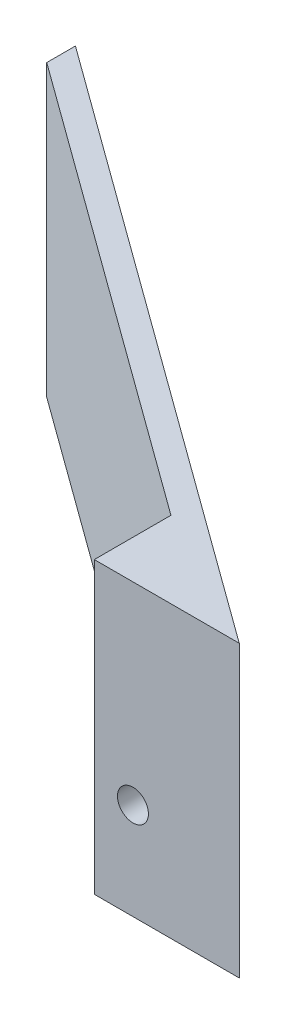
ISO-10303-21;
HEADER;
FILE_DESCRIPTION(('STEP AP214'),'2;1');
FILE_NAME('part.step','',(''),(''),'','','');
FILE_SCHEMA(('AUTOMOTIVE_DESIGN { 1 0 10303 214 1 1 1 1 }'));
ENDSEC;
DATA;
#1=APPLICATION_CONTEXT('core data for automotive mechanical design processes');
#2=APPLICATION_PROTOCOL_DEFINITION('international standard','automotive_design',2000,#1);
#3=PRODUCT_CONTEXT('',#1,'mechanical');
#4=PRODUCT('Part','Part','',(#3));
#5=PRODUCT_RELATED_PRODUCT_CATEGORY('part','',(#4));
#6=PRODUCT_DEFINITION_FORMATION('','',#4);
#7=PRODUCT_DEFINITION_CONTEXT('part definition',#1,'design');
#8=PRODUCT_DEFINITION('design','',#6,#7);
#9=PRODUCT_DEFINITION_SHAPE('','',#8);
#10=(LENGTH_UNIT() NAMED_UNIT(*) SI_UNIT(.MILLI.,.METRE.));
#11=(NAMED_UNIT(*) PLANE_ANGLE_UNIT() SI_UNIT($,.RADIAN.));
#12=(NAMED_UNIT(*) SI_UNIT($,.STERADIAN.) SOLID_ANGLE_UNIT());
#13=UNCERTAINTY_MEASURE_WITH_UNIT(LENGTH_MEASURE(1.E-05),#10,'distance_accuracy_value','');
#14=(GEOMETRIC_REPRESENTATION_CONTEXT(3) GLOBAL_UNCERTAINTY_ASSIGNED_CONTEXT((#13)) GLOBAL_UNIT_ASSIGNED_CONTEXT((#10,
#11,#12)) REPRESENTATION_CONTEXT('',''));
#15=CARTESIAN_POINT('',(0.,0.,0.));
#16=DIRECTION('',(0.,0.,1.));
#17=DIRECTION('',(1.,0.,0.));
#18=AXIS2_PLACEMENT_3D('',#15,#16,#17);
#19=CARTESIAN_POINT('',(-15.,30.,0.));
#20=DIRECTION('',(0.,0.,-1.));
#21=DIRECTION('',(-1.,0.,0.));
#22=AXIS2_PLACEMENT_3D('',#19,#20,#21);
#23=PLANE('',#22);
#24=CARTESIAN_POINT('',(-11.,10.,0.));
#25=DIRECTION('',(0.,0.,1.));
#26=DIRECTION('',(1.,0.,0.));
#27=AXIS2_PLACEMENT_3D('',#24,#25,#26);
#28=CIRCLE('',#27,1.6);
#29=CARTESIAN_POINT('',(-9.4,10.,0.));
#30=VERTEX_POINT('',#29);
#31=EDGE_CURVE('E123',#30,#30,#28,.T.);
#32=ORIENTED_EDGE('',*,*,#31,.F.);
#33=EDGE_LOOP('',(#32));
#34=FACE_BOUND('',#33,.T.);
#35=DIRECTION('',(1.,0.,0.));
#36=VECTOR('',#35,1.);
#37=CARTESIAN_POINT('',(-15.,0.,0.));
#38=LINE('',#37,#36);
#39=CARTESIAN_POINT('',(-15.,0.,0.));
#40=VERTEX_POINT('',#39);
#41=CARTESIAN_POINT('',(0.,0.,0.));
#42=VERTEX_POINT('',#41);
#43=EDGE_CURVE('E118',#40,#42,#38,.T.);
#44=ORIENTED_EDGE('',*,*,#43,.T.);
#45=DIRECTION('',(0.,-1.,0.));
#46=VECTOR('',#45,1.);
#47=CARTESIAN_POINT('',(0.,30.,0.));
#48=LINE('',#47,#46);
#49=CARTESIAN_POINT('',(0.,30.,0.));
#50=VERTEX_POINT('',#49);
#51=EDGE_CURVE('E11',#50,#42,#48,.T.);
#52=ORIENTED_EDGE('',*,*,#51,.F.);
#53=DIRECTION('',(1.,0.,0.));
#54=VECTOR('',#53,1.);
#55=CARTESIAN_POINT('',(-15.,30.,0.));
#56=LINE('',#55,#54);
#57=CARTESIAN_POINT('',(-15.,30.,0.));
#58=VERTEX_POINT('',#57);
#59=EDGE_CURVE('E132',#58,#50,#56,.T.);
#60=ORIENTED_EDGE('',*,*,#59,.F.);
#61=DIRECTION('',(0.,-1.,0.));
#62=VECTOR('',#61,1.);
#63=CARTESIAN_POINT('',(-15.,30.,0.));
#64=LINE('',#63,#62);
#65=EDGE_CURVE('E114',#58,#40,#64,.T.);
#66=ORIENTED_EDGE('',*,*,#65,.T.);
#67=EDGE_LOOP('',(#44,#52,#60,#66));
#68=FACE_BOUND('',#67,.T.);
#69=ADVANCED_FACE('F39',(#34,#68),#23,.F.);
#70=CARTESIAN_POINT('',(0.,30.,0.));
#71=DIRECTION('',(-0.587785252292472,0.,0.809016994374949));
#72=DIRECTION('',(0.809016994374949,0.,0.587785252292472));
#73=AXIS2_PLACEMENT_3D('',#70,#71,#72);
#74=PLANE('',#73);
#75=CARTESIAN_POINT('',(-11.,10.,-7.99196780805894));
#76=DIRECTION('',(-0.587785252292472,0.,0.809016994374949));
#77=DIRECTION('',(0.809016994374949,0.,0.587785252292472));
#78=AXIS2_PLACEMENT_3D('',#75,#76,#77);
#79=ELLIPSE('',#78,3.70820393249937,3.);
#80=CARTESIAN_POINT('',(-8.,10.,-5.81234022404286));
#81=VERTEX_POINT('',#80);
#82=EDGE_CURVE('E164',#81,#81,#79,.F.);
#83=ORIENTED_EDGE('',*,*,#82,.F.);
#84=EDGE_LOOP('',(#83));
#85=FACE_BOUND('',#84,.T.);
#86=DIRECTION('',(-0.809016994374949,0.,-0.587785252292472));
#87=VECTOR('',#86,1.);
#88=CARTESIAN_POINT('',(0.,0.,0.));
#89=LINE('',#88,#87);
#90=CARTESIAN_POINT('',(-62.,0.,-45.0456367363322));
#91=VERTEX_POINT('',#90);
#92=EDGE_CURVE('E122',#42,#91,#89,.T.);
#93=ORIENTED_EDGE('',*,*,#92,.T.);
#94=DIRECTION('',(0.,-1.,0.));
#95=VECTOR('',#94,1.);
#96=CARTESIAN_POINT('',(-62.,30.,-45.0456367363322));
#97=LINE('',#96,#95);
#98=CARTESIAN_POINT('',(-62.,30.,-45.0456367363322));
#99=VERTEX_POINT('',#98);
#100=EDGE_CURVE('E48',#99,#91,#97,.T.);
#101=ORIENTED_EDGE('',*,*,#100,.F.);
#102=DIRECTION('',(-0.809016994374949,0.,-0.587785252292472));
#103=VECTOR('',#102,1.);
#104=CARTESIAN_POINT('',(0.,30.,0.));
#105=LINE('',#104,#103);
#106=EDGE_CURVE('E90',#50,#99,#105,.T.);
#107=ORIENTED_EDGE('',*,*,#106,.F.);
#108=ORIENTED_EDGE('',*,*,#51,.T.);
#109=EDGE_LOOP('',(#93,#101,#107,#108));
#110=FACE_BOUND('',#109,.T.);
#111=ADVANCED_FACE('F154',(#85,#110),#74,.F.);
#112=CARTESIAN_POINT('',(-62.,30.,-45.0456367363322));
#113=DIRECTION('',(1.,0.,0.));
#114=DIRECTION('',(0.,0.,-1.));
#115=AXIS2_PLACEMENT_3D('',#112,#113,#114);
#116=PLANE('',#115);
#117=DIRECTION('',(0.,0.,1.));
#118=VECTOR('',#117,1.);
#119=CARTESIAN_POINT('',(-62.,0.,-45.0456367363322));
#120=LINE('',#119,#118);
#121=CARTESIAN_POINT('',(-62.,0.,-42.0790735903327));
#122=VERTEX_POINT('',#121);
#123=EDGE_CURVE('E106',#91,#122,#120,.T.);
#124=ORIENTED_EDGE('',*,*,#123,.T.);
#125=DIRECTION('',(0.,-1.,0.));
#126=VECTOR('',#125,1.);
#127=CARTESIAN_POINT('',(-62.,30.,-42.0790735903327));
#128=LINE('',#127,#126);
#129=CARTESIAN_POINT('',(-62.,30.,-42.0790735903327));
#130=VERTEX_POINT('',#129);
#131=EDGE_CURVE('E103',#130,#122,#128,.T.);
#132=ORIENTED_EDGE('',*,*,#131,.F.);
#133=DIRECTION('',(0.,0.,1.));
#134=VECTOR('',#133,1.);
#135=CARTESIAN_POINT('',(-62.,30.,-45.0456367363322));
#136=LINE('',#135,#134);
#137=EDGE_CURVE('E94',#99,#130,#136,.T.);
#138=ORIENTED_EDGE('',*,*,#137,.F.);
#139=ORIENTED_EDGE('',*,*,#100,.T.);
#140=EDGE_LOOP('',(#124,#132,#138,#139));
#141=FACE_BOUND('',#140,.T.);
#142=ADVANCED_FACE('F104',(#141),#116,.F.);
#143=CARTESIAN_POINT('',(-62.,30.,-42.0790735903327));
#144=DIRECTION('',(0.587785252292471,0.,-0.809016994374949));
#145=DIRECTION('',(-0.809016994374949,0.,-0.587785252292471));
#146=AXIS2_PLACEMENT_3D('',#143,#144,#145);
#147=PLANE('',#146);
#148=DIRECTION('',(0.809016994374949,0.,0.587785252292471));
#149=VECTOR('',#148,1.);
#150=CARTESIAN_POINT('',(-62.,0.,-42.0790735903327));
#151=LINE('',#150,#149);
#152=CARTESIAN_POINT('',(-15.,0.,-7.93157477408089));
#153=VERTEX_POINT('',#152);
#154=EDGE_CURVE('E76',#122,#153,#151,.T.);
#155=ORIENTED_EDGE('',*,*,#154,.T.);
#156=DIRECTION('',(0.,-1.,0.));
#157=VECTOR('',#156,1.);
#158=CARTESIAN_POINT('',(-15.,30.,-7.93157477408089));
#159=LINE('',#158,#157);
#160=CARTESIAN_POINT('',(-15.,30.,-7.93157477408089));
#161=VERTEX_POINT('',#160);
#162=EDGE_CURVE('E108',#161,#153,#159,.T.);
#163=ORIENTED_EDGE('',*,*,#162,.F.);
#164=DIRECTION('',(0.809016994374949,0.,0.587785252292471));
#165=VECTOR('',#164,1.);
#166=CARTESIAN_POINT('',(-62.,30.,-42.0790735903327));
#167=LINE('',#166,#165);
#168=EDGE_CURVE('E98',#130,#161,#167,.T.);
#169=ORIENTED_EDGE('',*,*,#168,.F.);
#170=ORIENTED_EDGE('',*,*,#131,.T.);
#171=EDGE_LOOP('',(#155,#163,#169,#170));
#172=FACE_BOUND('',#171,.T.);
#173=ADVANCED_FACE('F110',(#172),#147,.F.);
#174=CARTESIAN_POINT('',(-15.,30.,-7.93157477408089));
#175=DIRECTION('',(1.,0.,0.));
#176=DIRECTION('',(0.,0.,-1.));
#177=AXIS2_PLACEMENT_3D('',#174,#175,#176);
#178=PLANE('',#177);
#179=DIRECTION('',(0.,0.,1.));
#180=VECTOR('',#179,1.);
#181=CARTESIAN_POINT('',(-15.,0.,-7.93157477408089));
#182=LINE('',#181,#180);
#183=EDGE_CURVE('E82',#153,#40,#182,.T.);
#184=ORIENTED_EDGE('',*,*,#183,.T.);
#185=ORIENTED_EDGE('',*,*,#65,.F.);
#186=DIRECTION('',(0.,0.,1.));
#187=VECTOR('',#186,1.);
#188=CARTESIAN_POINT('',(-15.,30.,-7.93157477408089));
#189=LINE('',#188,#187);
#190=EDGE_CURVE('E56',#161,#58,#189,.T.);
#191=ORIENTED_EDGE('',*,*,#190,.F.);
#192=ORIENTED_EDGE('',*,*,#162,.T.);
#193=EDGE_LOOP('',(#184,#185,#191,#192));
#194=FACE_BOUND('',#193,.T.);
#195=ADVANCED_FACE('F143',(#194),#178,.F.);
#196=CARTESIAN_POINT('',(0.,30.,0.));
#197=DIRECTION('',(0.,-1.,0.));
#198=DIRECTION('',(0.,0.,-1.));
#199=AXIS2_PLACEMENT_3D('',#196,#197,#198);
#200=PLANE('',#199);
#201=ORIENTED_EDGE('',*,*,#59,.T.);
#202=ORIENTED_EDGE('',*,*,#106,.T.);
#203=ORIENTED_EDGE('',*,*,#137,.T.);
#204=ORIENTED_EDGE('',*,*,#168,.T.);
#205=ORIENTED_EDGE('',*,*,#190,.T.);
#206=EDGE_LOOP('',(#201,#202,#203,#204,#205));
#207=FACE_BOUND('',#206,.T.);
#208=ADVANCED_FACE('F96',(#207),#200,.F.);
#209=CARTESIAN_POINT('',(0.,0.,0.));
#210=DIRECTION('',(0.,-1.,0.));
#211=DIRECTION('',(0.,0.,-1.));
#212=AXIS2_PLACEMENT_3D('',#209,#210,#211);
#213=PLANE('',#212);
#214=ORIENTED_EDGE('',*,*,#43,.F.);
#215=ORIENTED_EDGE('',*,*,#183,.F.);
#216=ORIENTED_EDGE('',*,*,#154,.F.);
#217=ORIENTED_EDGE('',*,*,#123,.F.);
#218=ORIENTED_EDGE('',*,*,#92,.F.);
#219=EDGE_LOOP('',(#214,#215,#216,#217,#218));
#220=FACE_BOUND('',#219,.T.);
#221=ADVANCED_FACE('F139',(#220),#213,.T.);
#222=CARTESIAN_POINT('',(-11.,10.,-45.0456367363322));
#223=DIRECTION('',(0.,0.,1.));
#224=DIRECTION('',(1.,0.,0.));
#225=AXIS2_PLACEMENT_3D('',#222,#223,#224);
#226=CYLINDRICAL_SURFACE('',#225,1.6);
#227=CARTESIAN_POINT('',(-11.,10.,-3.));
#228=DIRECTION('',(0.,0.,1.));
#229=DIRECTION('',(1.,0.,0.));
#230=AXIS2_PLACEMENT_3D('',#227,#228,#229);
#231=CIRCLE('',#230,1.6);
#232=CARTESIAN_POINT('',(-9.4,10.,-3.));
#233=VERTEX_POINT('',#232);
#234=EDGE_CURVE('E168',#233,#233,#231,.T.);
#235=ORIENTED_EDGE('',*,*,#234,.F.);
#236=EDGE_LOOP('',(#235));
#237=FACE_BOUND('',#236,.T.);
#238=ORIENTED_EDGE('',*,*,#31,.T.);
#239=EDGE_LOOP('',(#238));
#240=FACE_BOUND('',#239,.T.);
#241=ADVANCED_FACE('F192',(#237,#240),#226,.F.);
#242=CARTESIAN_POINT('',(-11.,10.,-45.0466367363322));
#243=DIRECTION('',(0.,0.,1.));
#244=DIRECTION('',(1.,0.,0.));
#245=AXIS2_PLACEMENT_3D('',#242,#243,#244);
#246=CYLINDRICAL_SURFACE('',#245,3.);
#247=CARTESIAN_POINT('',(-11.,10.,-3.));
#248=DIRECTION('',(0.,0.,1.));
#249=DIRECTION('',(1.,0.,0.));
#250=AXIS2_PLACEMENT_3D('',#247,#248,#249);
#251=CIRCLE('',#250,3.);
#252=CARTESIAN_POINT('',(-8.,10.,-3.));
#253=VERTEX_POINT('',#252);
#254=EDGE_CURVE('E177',#253,#253,#251,.T.);
#255=ORIENTED_EDGE('',*,*,#254,.T.);
#256=EDGE_LOOP('',(#255));
#257=FACE_BOUND('',#256,.T.);
#258=ORIENTED_EDGE('',*,*,#82,.T.);
#259=EDGE_LOOP('',(#258));
#260=FACE_BOUND('',#259,.T.);
#261=ADVANCED_FACE('F182',(#257,#260),#246,.F.);
#262=CARTESIAN_POINT('',(-11.,10.,-3.));
#263=DIRECTION('',(0.,0.,1.));
#264=DIRECTION('',(1.,0.,0.));
#265=AXIS2_PLACEMENT_3D('',#262,#263,#264);
#266=PLANE('',#265);
#267=ORIENTED_EDGE('',*,*,#234,.T.);
#268=EDGE_LOOP('',(#267));
#269=FACE_BOUND('',#268,.T.);
#270=ORIENTED_EDGE('',*,*,#254,.F.);
#271=EDGE_LOOP('',(#270));
#272=FACE_BOUND('',#271,.T.);
#273=ADVANCED_FACE('F185',(#269,#272),#266,.F.);
#274=CLOSED_SHELL('',(#69,#111,#142,#173,#195,#208,#221,#241,#261,#273));
#275=MANIFOLD_SOLID_BREP('B2',#274);
#276=ADVANCED_BREP_SHAPE_REPRESENTATION('',(#18,#275),#14);
#277=SHAPE_DEFINITION_REPRESENTATION(#9,#276);
ENDSEC;
END-ISO-10303-21;
